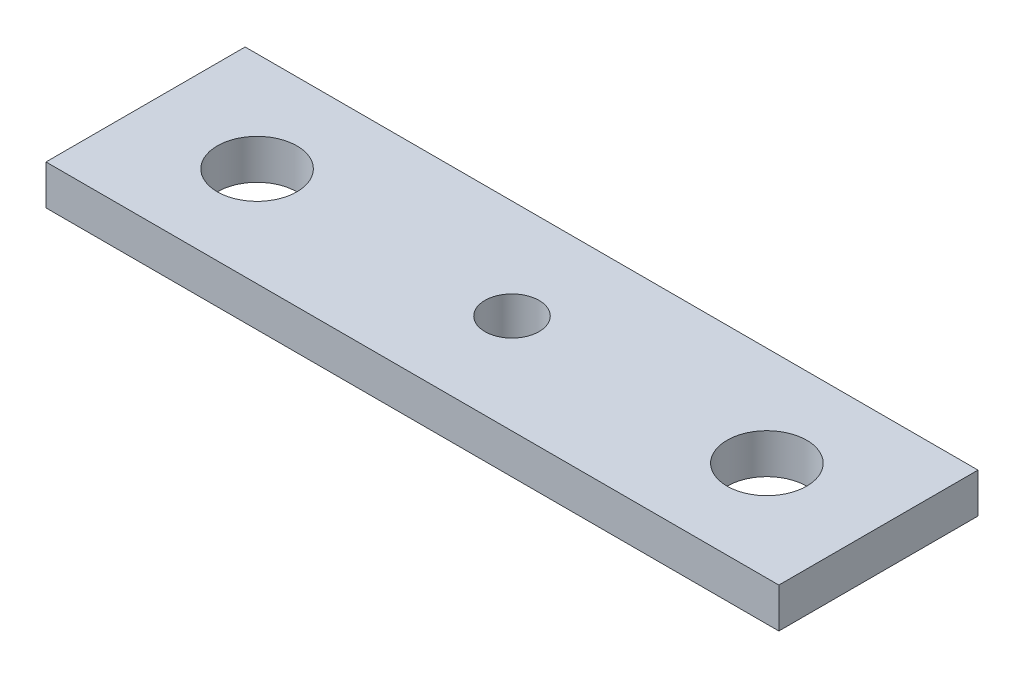
ISO-10303-21;
HEADER;
FILE_DESCRIPTION(('STEP AP214'),'2;1');
FILE_NAME('part.step','',(''),(''),'','','');
FILE_SCHEMA(('AUTOMOTIVE_DESIGN { 1 0 10303 214 1 1 1 1 }'));
ENDSEC;
DATA;
#1=APPLICATION_CONTEXT('core data for automotive mechanical design processes');
#2=APPLICATION_PROTOCOL_DEFINITION('international standard','automotive_design',2000,#1);
#3=PRODUCT_CONTEXT('',#1,'mechanical');
#4=PRODUCT('Part','Part','',(#3));
#5=PRODUCT_RELATED_PRODUCT_CATEGORY('part','',(#4));
#6=PRODUCT_DEFINITION_FORMATION('','',#4);
#7=PRODUCT_DEFINITION_CONTEXT('part definition',#1,'design');
#8=PRODUCT_DEFINITION('design','',#6,#7);
#9=PRODUCT_DEFINITION_SHAPE('','',#8);
#10=(LENGTH_UNIT() NAMED_UNIT(*) SI_UNIT(.MILLI.,.METRE.));
#11=(NAMED_UNIT(*) PLANE_ANGLE_UNIT() SI_UNIT($,.RADIAN.));
#12=(NAMED_UNIT(*) SI_UNIT($,.STERADIAN.) SOLID_ANGLE_UNIT());
#13=UNCERTAINTY_MEASURE_WITH_UNIT(LENGTH_MEASURE(1.E-05),#10,'distance_accuracy_value','');
#14=(GEOMETRIC_REPRESENTATION_CONTEXT(3) GLOBAL_UNCERTAINTY_ASSIGNED_CONTEXT((#13)) GLOBAL_UNIT_ASSIGNED_CONTEXT((#10,
#11,#12)) REPRESENTATION_CONTEXT('',''));
#15=CARTESIAN_POINT('',(0.,0.,0.));
#16=DIRECTION('',(0.,0.,1.));
#17=DIRECTION('',(1.,0.,0.));
#18=AXIS2_PLACEMENT_3D('',#15,#16,#17);
#19=CARTESIAN_POINT('',(46.,2.5,12.5));
#20=DIRECTION('',(-1.,0.,0.));
#21=DIRECTION('',(0.,0.,1.));
#22=AXIS2_PLACEMENT_3D('',#19,#20,#21);
#23=PLANE('',#22);
#24=DIRECTION('',(0.,0.,-1.));
#25=VECTOR('',#24,1.);
#26=CARTESIAN_POINT('',(46.,-2.5,12.5));
#27=LINE('',#26,#25);
#28=CARTESIAN_POINT('',(46.,-2.5,12.5));
#29=VERTEX_POINT('',#28);
#30=CARTESIAN_POINT('',(46.,-2.5,-12.5));
#31=VERTEX_POINT('',#30);
#32=EDGE_CURVE('E108',#29,#31,#27,.T.);
#33=ORIENTED_EDGE('',*,*,#32,.T.);
#34=DIRECTION('',(0.,-1.,0.));
#35=VECTOR('',#34,1.);
#36=CARTESIAN_POINT('',(46.,2.5,-12.5));
#37=LINE('',#36,#35);
#38=CARTESIAN_POINT('',(46.,2.5,-12.5));
#39=VERTEX_POINT('',#38);
#40=EDGE_CURVE('E11',#39,#31,#37,.T.);
#41=ORIENTED_EDGE('',*,*,#40,.F.);
#42=DIRECTION('',(0.,0.,-1.));
#43=VECTOR('',#42,1.);
#44=CARTESIAN_POINT('',(46.,2.5,12.5));
#45=LINE('',#44,#43);
#46=CARTESIAN_POINT('',(46.,2.5,12.5));
#47=VERTEX_POINT('',#46);
#48=EDGE_CURVE('E96',#47,#39,#45,.T.);
#49=ORIENTED_EDGE('',*,*,#48,.F.);
#50=DIRECTION('',(0.,-1.,0.));
#51=VECTOR('',#50,1.);
#52=CARTESIAN_POINT('',(46.,2.5,12.5));
#53=LINE('',#52,#51);
#54=EDGE_CURVE('E104',#47,#29,#53,.T.);
#55=ORIENTED_EDGE('',*,*,#54,.T.);
#56=EDGE_LOOP('',(#33,#41,#49,#55));
#57=FACE_BOUND('',#56,.T.);
#58=ADVANCED_FACE('F45',(#57),#23,.F.);
#59=CARTESIAN_POINT('',(-46.,2.5,-12.5));
#60=DIRECTION('',(0.,0.,1.));
#61=DIRECTION('',(1.,0.,0.));
#62=AXIS2_PLACEMENT_3D('',#59,#60,#61);
#63=PLANE('',#62);
#64=DIRECTION('',(-1.,0.,0.));
#65=VECTOR('',#64,1.);
#66=CARTESIAN_POINT('',(-46.,-2.5,-12.5));
#67=LINE('',#66,#65);
#68=CARTESIAN_POINT('',(-46.,-2.5,-12.5));
#69=VERTEX_POINT('',#68);
#70=EDGE_CURVE('E100',#31,#69,#67,.T.);
#71=ORIENTED_EDGE('',*,*,#70,.T.);
#72=DIRECTION('',(0.,-1.,0.));
#73=VECTOR('',#72,1.);
#74=CARTESIAN_POINT('',(-46.,2.5,-12.5));
#75=LINE('',#74,#73);
#76=CARTESIAN_POINT('',(-46.,2.5,-12.5));
#77=VERTEX_POINT('',#76);
#78=EDGE_CURVE('E53',#77,#69,#75,.T.);
#79=ORIENTED_EDGE('',*,*,#78,.F.);
#80=DIRECTION('',(-1.,0.,0.));
#81=VECTOR('',#80,1.);
#82=CARTESIAN_POINT('',(-46.,2.5,-12.5));
#83=LINE('',#82,#81);
#84=EDGE_CURVE('E91',#39,#77,#83,.T.);
#85=ORIENTED_EDGE('',*,*,#84,.F.);
#86=ORIENTED_EDGE('',*,*,#40,.T.);
#87=EDGE_LOOP('',(#71,#79,#85,#86));
#88=FACE_BOUND('',#87,.T.);
#89=ADVANCED_FACE('F99',(#88),#63,.F.);
#90=CARTESIAN_POINT('',(-46.,2.5,12.5));
#91=DIRECTION('',(1.,0.,0.));
#92=DIRECTION('',(0.,0.,-1.));
#93=AXIS2_PLACEMENT_3D('',#90,#91,#92);
#94=PLANE('',#93);
#95=DIRECTION('',(0.,0.,1.));
#96=VECTOR('',#95,1.);
#97=CARTESIAN_POINT('',(-46.,-2.5,12.5));
#98=LINE('',#97,#96);
#99=CARTESIAN_POINT('',(-46.,-2.5,12.5));
#100=VERTEX_POINT('',#99);
#101=EDGE_CURVE('E78',#69,#100,#98,.T.);
#102=ORIENTED_EDGE('',*,*,#101,.T.);
#103=DIRECTION('',(0.,-1.,0.));
#104=VECTOR('',#103,1.);
#105=CARTESIAN_POINT('',(-46.,2.5,12.5));
#106=LINE('',#105,#104);
#107=CARTESIAN_POINT('',(-46.,2.5,12.5));
#108=VERTEX_POINT('',#107);
#109=EDGE_CURVE('E101',#108,#100,#106,.T.);
#110=ORIENTED_EDGE('',*,*,#109,.F.);
#111=DIRECTION('',(0.,0.,1.));
#112=VECTOR('',#111,1.);
#113=CARTESIAN_POINT('',(-46.,2.5,12.5));
#114=LINE('',#113,#112);
#115=EDGE_CURVE('E94',#77,#108,#114,.T.);
#116=ORIENTED_EDGE('',*,*,#115,.F.);
#117=ORIENTED_EDGE('',*,*,#78,.T.);
#118=EDGE_LOOP('',(#102,#110,#116,#117));
#119=FACE_BOUND('',#118,.T.);
#120=ADVANCED_FACE('F102',(#119),#94,.F.);
#121=CARTESIAN_POINT('',(-46.,2.5,12.5));
#122=DIRECTION('',(0.,0.,-1.));
#123=DIRECTION('',(-1.,0.,0.));
#124=AXIS2_PLACEMENT_3D('',#121,#122,#123);
#125=PLANE('',#124);
#126=DIRECTION('',(1.,0.,0.));
#127=VECTOR('',#126,1.);
#128=CARTESIAN_POINT('',(-46.,-2.5,12.5));
#129=LINE('',#128,#127);
#130=EDGE_CURVE('E84',#100,#29,#129,.T.);
#131=ORIENTED_EDGE('',*,*,#130,.T.);
#132=ORIENTED_EDGE('',*,*,#54,.F.);
#133=DIRECTION('',(1.,0.,0.));
#134=VECTOR('',#133,1.);
#135=CARTESIAN_POINT('',(-46.,2.5,12.5));
#136=LINE('',#135,#134);
#137=EDGE_CURVE('E61',#108,#47,#136,.T.);
#138=ORIENTED_EDGE('',*,*,#137,.F.);
#139=ORIENTED_EDGE('',*,*,#109,.T.);
#140=EDGE_LOOP('',(#131,#132,#138,#139));
#141=FACE_BOUND('',#140,.T.);
#142=ADVANCED_FACE('F116',(#141),#125,.F.);
#143=CARTESIAN_POINT('',(0.,2.5,0.));
#144=DIRECTION('',(0.,-1.,0.));
#145=DIRECTION('',(0.,0.,-1.));
#146=AXIS2_PLACEMENT_3D('',#143,#144,#145);
#147=PLANE('',#146);
#148=CARTESIAN_POINT('',(0.,2.5,0.));
#149=DIRECTION('',(0.,1.,0.));
#150=DIRECTION('',(0.,0.,1.));
#151=AXIS2_PLACEMENT_3D('',#148,#149,#150);
#152=CIRCLE('',#151,3.39999999999999);
#153=CARTESIAN_POINT('',(0.,2.5,3.39999999999999));
#154=VERTEX_POINT('',#153);
#155=EDGE_CURVE('E136',#154,#154,#152,.T.);
#156=ORIENTED_EDGE('',*,*,#155,.F.);
#157=EDGE_LOOP('',(#156));
#158=FACE_BOUND('',#157,.T.);
#159=CARTESIAN_POINT('',(32.,2.5,0.));
#160=DIRECTION('',(0.,1.,0.));
#161=DIRECTION('',(0.,0.,1.));
#162=AXIS2_PLACEMENT_3D('',#159,#160,#161);
#163=CIRCLE('',#162,5.);
#164=CARTESIAN_POINT('',(32.,2.5,4.99999999999999));
#165=VERTEX_POINT('',#164);
#166=EDGE_CURVE('E129',#165,#165,#163,.T.);
#167=ORIENTED_EDGE('',*,*,#166,.F.);
#168=EDGE_LOOP('',(#167));
#169=FACE_BOUND('',#168,.T.);
#170=CARTESIAN_POINT('',(-32.,2.5,0.));
#171=DIRECTION('',(0.,1.,0.));
#172=DIRECTION('',(0.,0.,1.));
#173=AXIS2_PLACEMENT_3D('',#170,#171,#172);
#174=CIRCLE('',#173,5.);
#175=CARTESIAN_POINT('',(-32.,2.5,5.));
#176=VERTEX_POINT('',#175);
#177=EDGE_CURVE('E125',#176,#176,#174,.T.);
#178=ORIENTED_EDGE('',*,*,#177,.F.);
#179=EDGE_LOOP('',(#178));
#180=FACE_BOUND('',#179,.T.);
#181=ORIENTED_EDGE('',*,*,#48,.T.);
#182=ORIENTED_EDGE('',*,*,#84,.T.);
#183=ORIENTED_EDGE('',*,*,#115,.T.);
#184=ORIENTED_EDGE('',*,*,#137,.T.);
#185=EDGE_LOOP('',(#181,#182,#183,#184));
#186=FACE_BOUND('',#185,.T.);
#187=ADVANCED_FACE('F92',(#158,#169,#180,#186),#147,.F.);
#188=CARTESIAN_POINT('',(0.,-2.5,0.));
#189=DIRECTION('',(0.,-1.,0.));
#190=DIRECTION('',(0.,0.,-1.));
#191=AXIS2_PLACEMENT_3D('',#188,#189,#190);
#192=PLANE('',#191);
#193=CARTESIAN_POINT('',(0.,-2.5,0.));
#194=DIRECTION('',(0.,1.,0.));
#195=DIRECTION('',(0.,0.,1.));
#196=AXIS2_PLACEMENT_3D('',#193,#194,#195);
#197=CIRCLE('',#196,3.4);
#198=CARTESIAN_POINT('',(0.,-2.5,3.4));
#199=VERTEX_POINT('',#198);
#200=EDGE_CURVE('E126',#199,#199,#197,.T.);
#201=ORIENTED_EDGE('',*,*,#200,.T.);
#202=EDGE_LOOP('',(#201));
#203=FACE_BOUND('',#202,.T.);
#204=CARTESIAN_POINT('',(32.,-2.5,0.));
#205=DIRECTION('',(0.,1.,0.));
#206=DIRECTION('',(0.,0.,1.));
#207=AXIS2_PLACEMENT_3D('',#204,#205,#206);
#208=CIRCLE('',#207,5.);
#209=CARTESIAN_POINT('',(32.,-2.5,4.99999999999999));
#210=VERTEX_POINT('',#209);
#211=EDGE_CURVE('E111',#210,#210,#208,.T.);
#212=ORIENTED_EDGE('',*,*,#211,.T.);
#213=EDGE_LOOP('',(#212));
#214=FACE_BOUND('',#213,.T.);
#215=CARTESIAN_POINT('',(-32.,-2.5,0.));
#216=DIRECTION('',(0.,1.,0.));
#217=DIRECTION('',(0.,0.,1.));
#218=AXIS2_PLACEMENT_3D('',#215,#216,#217);
#219=CIRCLE('',#218,5.);
#220=CARTESIAN_POINT('',(-32.,-2.5,5.));
#221=VERTEX_POINT('',#220);
#222=EDGE_CURVE('E122',#221,#221,#219,.T.);
#223=ORIENTED_EDGE('',*,*,#222,.T.);
#224=EDGE_LOOP('',(#223));
#225=FACE_BOUND('',#224,.T.);
#226=ORIENTED_EDGE('',*,*,#32,.F.);
#227=ORIENTED_EDGE('',*,*,#130,.F.);
#228=ORIENTED_EDGE('',*,*,#101,.F.);
#229=ORIENTED_EDGE('',*,*,#70,.F.);
#230=EDGE_LOOP('',(#226,#227,#228,#229));
#231=FACE_BOUND('',#230,.T.);
#232=ADVANCED_FACE('F119',(#203,#214,#225,#231),#192,.T.);
#233=CARTESIAN_POINT('',(-32.,-2.5,0.));
#234=DIRECTION('',(0.,1.,0.));
#235=DIRECTION('',(0.,0.,1.));
#236=AXIS2_PLACEMENT_3D('',#233,#234,#235);
#237=CYLINDRICAL_SURFACE('',#236,5.);
#238=ORIENTED_EDGE('',*,*,#222,.F.);
#239=EDGE_LOOP('',(#238));
#240=FACE_BOUND('',#239,.T.);
#241=ORIENTED_EDGE('',*,*,#177,.T.);
#242=EDGE_LOOP('',(#241));
#243=FACE_BOUND('',#242,.T.);
#244=ADVANCED_FACE('F149',(#240,#243),#237,.F.);
#245=CARTESIAN_POINT('',(32.,-2.5,0.));
#246=DIRECTION('',(0.,1.,0.));
#247=DIRECTION('',(0.,0.,1.));
#248=AXIS2_PLACEMENT_3D('',#245,#246,#247);
#249=CYLINDRICAL_SURFACE('',#248,5.);
#250=ORIENTED_EDGE('',*,*,#211,.F.);
#251=EDGE_LOOP('',(#250));
#252=FACE_BOUND('',#251,.T.);
#253=ORIENTED_EDGE('',*,*,#166,.T.);
#254=EDGE_LOOP('',(#253));
#255=FACE_BOUND('',#254,.T.);
#256=ADVANCED_FACE('F151',(#252,#255),#249,.F.);
#257=CARTESIAN_POINT('',(0.,2.5,0.));
#258=DIRECTION('',(0.,1.,0.));
#259=DIRECTION('',(0.,0.,1.));
#260=AXIS2_PLACEMENT_3D('',#257,#258,#259);
#261=CYLINDRICAL_SURFACE('',#260,3.39999999999999);
#262=ORIENTED_EDGE('',*,*,#200,.F.);
#263=EDGE_LOOP('',(#262));
#264=FACE_BOUND('',#263,.T.);
#265=ORIENTED_EDGE('',*,*,#155,.T.);
#266=EDGE_LOOP('',(#265));
#267=FACE_BOUND('',#266,.T.);
#268=ADVANCED_FACE('F140',(#264,#267),#261,.F.);
#269=CLOSED_SHELL('',(#58,#89,#120,#142,#187,#232,#244,#256,#268));
#270=MANIFOLD_SOLID_BREP('B2',#269);
#271=ADVANCED_BREP_SHAPE_REPRESENTATION('',(#18,#270),#14);
#272=SHAPE_DEFINITION_REPRESENTATION(#9,#271);
ENDSEC;
END-ISO-10303-21;
